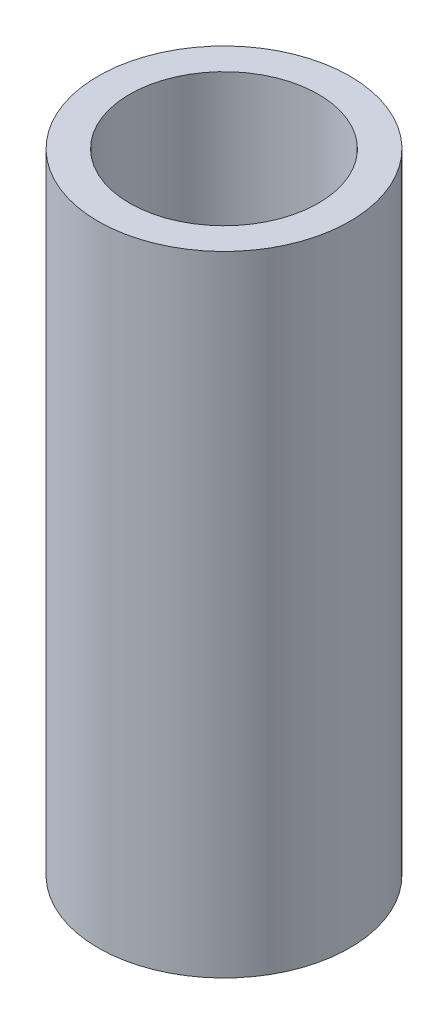
ISO-10303-21;
HEADER;
FILE_DESCRIPTION(('STEP AP214'),'2;1');
FILE_NAME('part.step','',(''),(''),'','','');
FILE_SCHEMA(('AUTOMOTIVE_DESIGN { 1 0 10303 214 1 1 1 1 }'));
ENDSEC;
DATA;
#1=APPLICATION_CONTEXT('core data for automotive mechanical design processes');
#2=APPLICATION_PROTOCOL_DEFINITION('international standard','automotive_design',2000,#1);
#3=PRODUCT_CONTEXT('',#1,'mechanical');
#4=PRODUCT('Part','Part','',(#3));
#5=PRODUCT_RELATED_PRODUCT_CATEGORY('part','',(#4));
#6=PRODUCT_DEFINITION_FORMATION('','',#4);
#7=PRODUCT_DEFINITION_CONTEXT('part definition',#1,'design');
#8=PRODUCT_DEFINITION('design','',#6,#7);
#9=PRODUCT_DEFINITION_SHAPE('','',#8);
#10=(LENGTH_UNIT() NAMED_UNIT(*) SI_UNIT(.MILLI.,.METRE.));
#11=(NAMED_UNIT(*) PLANE_ANGLE_UNIT() SI_UNIT($,.RADIAN.));
#12=(NAMED_UNIT(*) SI_UNIT($,.STERADIAN.) SOLID_ANGLE_UNIT());
#13=UNCERTAINTY_MEASURE_WITH_UNIT(LENGTH_MEASURE(1.E-05),#10,'distance_accuracy_value','');
#14=(GEOMETRIC_REPRESENTATION_CONTEXT(3) GLOBAL_UNCERTAINTY_ASSIGNED_CONTEXT((#13)) GLOBAL_UNIT_ASSIGNED_CONTEXT((#10,
#11,#12)) REPRESENTATION_CONTEXT('',''));
#15=CARTESIAN_POINT('',(0.,0.,0.));
#16=DIRECTION('',(0.,0.,1.));
#17=DIRECTION('',(1.,0.,0.));
#18=AXIS2_PLACEMENT_3D('',#15,#16,#17);
#19=CARTESIAN_POINT('',(0.,50.,0.));
#20=DIRECTION('',(0.,-1.,0.));
#21=DIRECTION('',(0.,0.,-1.));
#22=AXIS2_PLACEMENT_3D('',#19,#20,#21);
#23=CYLINDRICAL_SURFACE('',#22,7.5);
#24=CARTESIAN_POINT('',(0.,50.,0.));
#25=DIRECTION('',(0.,1.,0.));
#26=DIRECTION('',(0.,0.,1.));
#27=AXIS2_PLACEMENT_3D('',#24,#25,#26);
#28=CIRCLE('',#27,7.5);
#29=CARTESIAN_POINT('',(0.,50.,7.5));
#30=VERTEX_POINT('',#29);
#31=EDGE_CURVE('E51',#30,#30,#28,.T.);
#32=ORIENTED_EDGE('',*,*,#31,.T.);
#33=EDGE_LOOP('',(#32));
#34=FACE_BOUND('',#33,.T.);
#35=CARTESIAN_POINT('',(0.,0.,0.));
#36=DIRECTION('',(0.,1.,0.));
#37=DIRECTION('',(0.,0.,1.));
#38=AXIS2_PLACEMENT_3D('',#35,#36,#37);
#39=CIRCLE('',#38,7.5);
#40=CARTESIAN_POINT('',(0.,0.,7.5));
#41=VERTEX_POINT('',#40);
#42=EDGE_CURVE('E57',#41,#41,#39,.T.);
#43=ORIENTED_EDGE('',*,*,#42,.F.);
#44=EDGE_LOOP('',(#43));
#45=FACE_BOUND('',#44,.T.);
#46=ADVANCED_FACE('F44',(#34,#45),#23,.F.);
#47=CARTESIAN_POINT('',(0.,50.,0.));
#48=DIRECTION('',(0.,-1.,0.));
#49=DIRECTION('',(0.,0.,-1.));
#50=AXIS2_PLACEMENT_3D('',#47,#48,#49);
#51=CYLINDRICAL_SURFACE('',#50,10.);
#52=CARTESIAN_POINT('',(0.,50.,0.));
#53=DIRECTION('',(0.,1.,0.));
#54=DIRECTION('',(0.,0.,1.));
#55=AXIS2_PLACEMENT_3D('',#52,#53,#54);
#56=CIRCLE('',#55,10.);
#57=CARTESIAN_POINT('',(0.,50.,10.));
#58=VERTEX_POINT('',#57);
#59=EDGE_CURVE('E11',#58,#58,#56,.T.);
#60=ORIENTED_EDGE('',*,*,#59,.F.);
#61=EDGE_LOOP('',(#60));
#62=FACE_BOUND('',#61,.T.);
#63=CARTESIAN_POINT('',(0.,0.,0.));
#64=DIRECTION('',(0.,1.,0.));
#65=DIRECTION('',(0.,0.,1.));
#66=AXIS2_PLACEMENT_3D('',#63,#64,#65);
#67=CIRCLE('',#66,10.);
#68=CARTESIAN_POINT('',(0.,0.,10.));
#69=VERTEX_POINT('',#68);
#70=EDGE_CURVE('E47',#69,#69,#67,.T.);
#71=ORIENTED_EDGE('',*,*,#70,.T.);
#72=EDGE_LOOP('',(#71));
#73=FACE_BOUND('',#72,.T.);
#74=ADVANCED_FACE('F64',(#62,#73),#51,.T.);
#75=CARTESIAN_POINT('',(0.,50.,0.));
#76=DIRECTION('',(0.,1.,0.));
#77=DIRECTION('',(0.,0.,1.));
#78=AXIS2_PLACEMENT_3D('',#75,#76,#77);
#79=PLANE('',#78);
#80=ORIENTED_EDGE('',*,*,#31,.F.);
#81=EDGE_LOOP('',(#80));
#82=FACE_BOUND('',#81,.T.);
#83=ORIENTED_EDGE('',*,*,#59,.T.);
#84=EDGE_LOOP('',(#83));
#85=FACE_BOUND('',#84,.T.);
#86=ADVANCED_FACE('F68',(#82,#85),#79,.T.);
#87=CARTESIAN_POINT('',(0.,0.,0.));
#88=DIRECTION('',(0.,1.,0.));
#89=DIRECTION('',(0.,0.,1.));
#90=AXIS2_PLACEMENT_3D('',#87,#88,#89);
#91=PLANE('',#90);
#92=ORIENTED_EDGE('',*,*,#42,.T.);
#93=EDGE_LOOP('',(#92));
#94=FACE_BOUND('',#93,.T.);
#95=ORIENTED_EDGE('',*,*,#70,.F.);
#96=EDGE_LOOP('',(#95));
#97=FACE_BOUND('',#96,.T.);
#98=ADVANCED_FACE('F66',(#94,#97),#91,.F.);
#99=CLOSED_SHELL('',(#46,#74,#86,#98));
#100=MANIFOLD_SOLID_BREP('B2',#99);
#101=ADVANCED_BREP_SHAPE_REPRESENTATION('',(#18,#100),#14);
#102=SHAPE_DEFINITION_REPRESENTATION(#9,#101);
ENDSEC;
END-ISO-10303-21;
